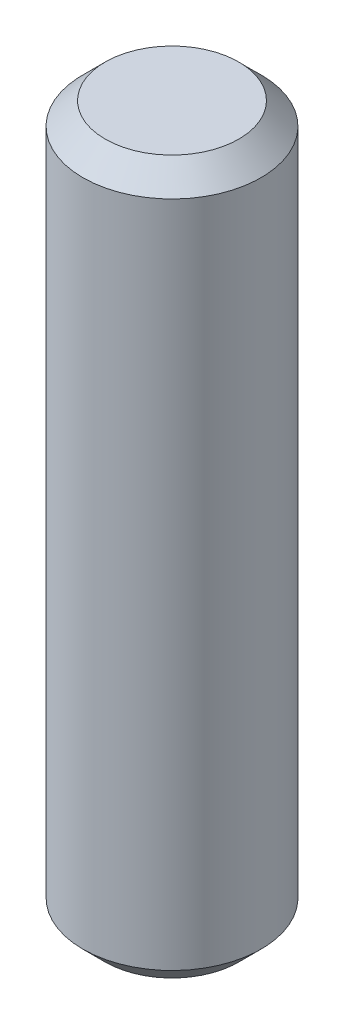
ISO-10303-21;
HEADER;
FILE_DESCRIPTION(('STEP AP214'),'2;1');
FILE_NAME('part.step','',(''),(''),'','','');
FILE_SCHEMA(('AUTOMOTIVE_DESIGN { 1 0 10303 214 1 1 1 1 }'));
ENDSEC;
DATA;
#1=APPLICATION_CONTEXT('core data for automotive mechanical design processes');
#2=APPLICATION_PROTOCOL_DEFINITION('international standard','automotive_design',2000,#1);
#3=PRODUCT_CONTEXT('',#1,'mechanical');
#4=PRODUCT('Part','Part','',(#3));
#5=PRODUCT_RELATED_PRODUCT_CATEGORY('part','',(#4));
#6=PRODUCT_DEFINITION_FORMATION('','',#4);
#7=PRODUCT_DEFINITION_CONTEXT('part definition',#1,'design');
#8=PRODUCT_DEFINITION('design','',#6,#7);
#9=PRODUCT_DEFINITION_SHAPE('','',#8);
#10=(LENGTH_UNIT() NAMED_UNIT(*) SI_UNIT(.MILLI.,.METRE.));
#11=(NAMED_UNIT(*) PLANE_ANGLE_UNIT() SI_UNIT($,.RADIAN.));
#12=(NAMED_UNIT(*) SI_UNIT($,.STERADIAN.) SOLID_ANGLE_UNIT());
#13=UNCERTAINTY_MEASURE_WITH_UNIT(LENGTH_MEASURE(1.E-05),#10,'distance_accuracy_value','');
#14=(GEOMETRIC_REPRESENTATION_CONTEXT(3) GLOBAL_UNCERTAINTY_ASSIGNED_CONTEXT((#13)) GLOBAL_UNIT_ASSIGNED_CONTEXT((#10,
#11,#12)) REPRESENTATION_CONTEXT('',''));
#15=CARTESIAN_POINT('',(0.,0.,0.));
#16=DIRECTION('',(0.,0.,1.));
#17=DIRECTION('',(1.,0.,0.));
#18=AXIS2_PLACEMENT_3D('',#15,#16,#17);
#19=CARTESIAN_POINT('',(0.,12.7,0.));
#20=DIRECTION('',(0.,-1.,0.));
#21=DIRECTION('',(0.,0.,-1.));
#22=AXIS2_PLACEMENT_3D('',#19,#20,#21);
#23=CYLINDRICAL_SURFACE('',#22,1.5875);
#24=CARTESIAN_POINT('',(0.,0.396874999999998,0.));
#25=DIRECTION('',(0.,1.,0.));
#26=DIRECTION('',(0.,0.,1.));
#27=AXIS2_PLACEMENT_3D('',#24,#25,#26);
#28=CIRCLE('',#27,1.5875);
#29=CARTESIAN_POINT('',(0.,0.396874999999998,1.5875));
#30=VERTEX_POINT('',#29);
#31=EDGE_CURVE('E42',#30,#30,#28,.T.);
#32=ORIENTED_EDGE('',*,*,#31,.T.);
#33=EDGE_LOOP('',(#32));
#34=FACE_BOUND('',#33,.T.);
#35=CARTESIAN_POINT('',(0.,12.303125,0.));
#36=DIRECTION('',(0.,1.,0.));
#37=DIRECTION('',(0.,0.,1.));
#38=AXIS2_PLACEMENT_3D('',#35,#36,#37);
#39=CIRCLE('',#38,1.5875);
#40=CARTESIAN_POINT('',(0.,12.303125,1.5875));
#41=VERTEX_POINT('',#40);
#42=EDGE_CURVE('E46',#41,#41,#39,.F.);
#43=ORIENTED_EDGE('',*,*,#42,.T.);
#44=EDGE_LOOP('',(#43));
#45=FACE_BOUND('',#44,.T.);
#46=ADVANCED_FACE('F31',(#34,#45),#23,.T.);
#47=CARTESIAN_POINT('',(0.,12.7,0.));
#48=DIRECTION('',(0.,1.,0.));
#49=DIRECTION('',(0.,0.,1.));
#50=AXIS2_PLACEMENT_3D('',#47,#48,#49);
#51=PLANE('',#50);
#52=CARTESIAN_POINT('',(0.,12.7,0.));
#53=DIRECTION('',(0.,1.,0.));
#54=DIRECTION('',(0.,0.,1.));
#55=AXIS2_PLACEMENT_3D('',#52,#53,#54);
#56=CIRCLE('',#55,1.190625);
#57=CARTESIAN_POINT('',(0.,12.7,1.190625));
#58=VERTEX_POINT('',#57);
#59=EDGE_CURVE('E10',#58,#58,#56,.T.);
#60=ORIENTED_EDGE('',*,*,#59,.T.);
#61=EDGE_LOOP('',(#60));
#62=FACE_BOUND('',#61,.T.);
#63=ADVANCED_FACE('F62',(#62),#51,.T.);
#64=CARTESIAN_POINT('',(0.,0.,0.));
#65=DIRECTION('',(0.,1.,0.));
#66=DIRECTION('',(0.,0.,1.));
#67=AXIS2_PLACEMENT_3D('',#64,#65,#66);
#68=PLANE('',#67);
#69=CARTESIAN_POINT('',(0.,0.,0.));
#70=DIRECTION('',(0.,1.,0.));
#71=DIRECTION('',(0.,0.,1.));
#72=AXIS2_PLACEMENT_3D('',#69,#70,#71);
#73=CIRCLE('',#72,1.190625);
#74=CARTESIAN_POINT('',(0.,0.,1.190625));
#75=VERTEX_POINT('',#74);
#76=EDGE_CURVE('E38',#75,#75,#73,.F.);
#77=ORIENTED_EDGE('',*,*,#76,.T.);
#78=EDGE_LOOP('',(#77));
#79=FACE_BOUND('',#78,.T.);
#80=ADVANCED_FACE('F59',(#79),#68,.F.);
#81=CARTESIAN_POINT('',(0.,0.396874999999998,0.));
#82=DIRECTION('',(0.,1.,0.));
#83=DIRECTION('',(0.,0.,1.));
#84=AXIS2_PLACEMENT_3D('',#81,#82,#83);
#85=CONICAL_SURFACE('',#84,1.5875,0.785398163397452);
#86=ORIENTED_EDGE('',*,*,#76,.F.);
#87=EDGE_LOOP('',(#86));
#88=FACE_BOUND('',#87,.T.);
#89=ORIENTED_EDGE('',*,*,#31,.F.);
#90=EDGE_LOOP('',(#89));
#91=FACE_BOUND('',#90,.T.);
#92=ADVANCED_FACE('F55',(#88,#91),#85,.T.);
#93=CARTESIAN_POINT('',(0.,12.7,0.));
#94=DIRECTION('',(0.,-1.,0.));
#95=DIRECTION('',(0.,0.,-1.));
#96=AXIS2_PLACEMENT_3D('',#93,#94,#95);
#97=CONICAL_SURFACE('',#96,1.190625,0.785398163397448);
#98=ORIENTED_EDGE('',*,*,#42,.F.);
#99=EDGE_LOOP('',(#98));
#100=FACE_BOUND('',#99,.T.);
#101=ORIENTED_EDGE('',*,*,#59,.F.);
#102=EDGE_LOOP('',(#101));
#103=FACE_BOUND('',#102,.T.);
#104=ADVANCED_FACE('F33',(#100,#103),#97,.T.);
#105=CLOSED_SHELL('',(#46,#63,#80,#92,#104));
#106=MANIFOLD_SOLID_BREP('B2',#105);
#107=ADVANCED_BREP_SHAPE_REPRESENTATION('',(#18,#106),#14);
#108=SHAPE_DEFINITION_REPRESENTATION(#9,#107);
ENDSEC;
END-ISO-10303-21;
